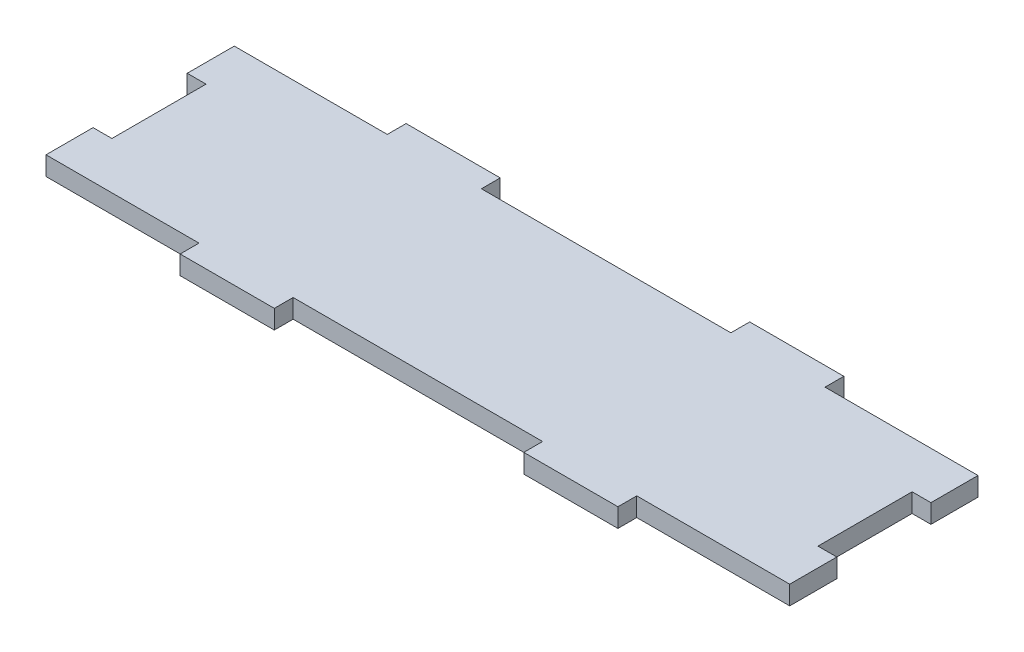
ISO-10303-21;
HEADER;
FILE_DESCRIPTION(('STEP AP214'),'2;1');
FILE_NAME('part.step','',(''),(''),'','','');
FILE_SCHEMA(('AUTOMOTIVE_DESIGN { 1 0 10303 214 1 1 1 1 }'));
ENDSEC;
DATA;
#1=APPLICATION_CONTEXT('core data for automotive mechanical design processes');
#2=APPLICATION_PROTOCOL_DEFINITION('international standard','automotive_design',2000,#1);
#3=PRODUCT_CONTEXT('',#1,'mechanical');
#4=PRODUCT('Part','Part','',(#3));
#5=PRODUCT_RELATED_PRODUCT_CATEGORY('part','',(#4));
#6=PRODUCT_DEFINITION_FORMATION('','',#4);
#7=PRODUCT_DEFINITION_CONTEXT('part definition',#1,'design');
#8=PRODUCT_DEFINITION('design','',#6,#7);
#9=PRODUCT_DEFINITION_SHAPE('','',#8);
#10=(LENGTH_UNIT() NAMED_UNIT(*) SI_UNIT(.MILLI.,.METRE.));
#11=(NAMED_UNIT(*) PLANE_ANGLE_UNIT() SI_UNIT($,.RADIAN.));
#12=(NAMED_UNIT(*) SI_UNIT($,.STERADIAN.) SOLID_ANGLE_UNIT());
#13=UNCERTAINTY_MEASURE_WITH_UNIT(LENGTH_MEASURE(1.E-05),#10,'distance_accuracy_value','');
#14=(GEOMETRIC_REPRESENTATION_CONTEXT(3) GLOBAL_UNCERTAINTY_ASSIGNED_CONTEXT((#13)) GLOBAL_UNIT_ASSIGNED_CONTEXT((#10,
#11,#12)) REPRESENTATION_CONTEXT('',''));
#15=CARTESIAN_POINT('',(0.,0.,0.));
#16=DIRECTION('',(0.,0.,1.));
#17=DIRECTION('',(1.,0.,0.));
#18=AXIS2_PLACEMENT_3D('',#15,#16,#17);
#19=CARTESIAN_POINT('',(0.,4.,0.));
#20=DIRECTION('',(0.,0.,-1.));
#21=DIRECTION('',(-1.,0.,0.));
#22=AXIS2_PLACEMENT_3D('',#19,#20,#21);
#23=PLANE('',#22);
#24=DIRECTION('',(1.,0.,0.));
#25=VECTOR('',#24,1.);
#26=CARTESIAN_POINT('',(0.,0.,0.));
#27=LINE('',#26,#25);
#28=CARTESIAN_POINT('',(-4.,0.,0.));
#29=VERTEX_POINT('',#28);
#30=CARTESIAN_POINT('',(28.5,0.,0.));
#31=VERTEX_POINT('',#30);
#32=EDGE_CURVE('E146',#29,#31,#27,.T.);
#33=ORIENTED_EDGE('',*,*,#32,.T.);
#34=DIRECTION('',(0.,-1.,0.));
#35=VECTOR('',#34,1.);
#36=CARTESIAN_POINT('',(28.5,4.,0.));
#37=LINE('',#36,#35);
#38=CARTESIAN_POINT('',(28.5,4.,0.));
#39=VERTEX_POINT('',#38);
#40=EDGE_CURVE('E11',#39,#31,#37,.T.);
#41=ORIENTED_EDGE('',*,*,#40,.F.);
#42=DIRECTION('',(1.,0.,0.));
#43=VECTOR('',#42,1.);
#44=CARTESIAN_POINT('',(0.,4.,0.));
#45=LINE('',#44,#43);
#46=CARTESIAN_POINT('',(-4.,4.,0.));
#47=VERTEX_POINT('',#46);
#48=EDGE_CURVE('E152',#47,#39,#45,.T.);
#49=ORIENTED_EDGE('',*,*,#48,.F.);
#50=DIRECTION('',(0.,-1.,0.));
#51=VECTOR('',#50,1.);
#52=CARTESIAN_POINT('',(-4.,4.,0.));
#53=LINE('',#52,#51);
#54=EDGE_CURVE('E246',#47,#29,#53,.T.);
#55=ORIENTED_EDGE('',*,*,#54,.T.);
#56=EDGE_LOOP('',(#33,#41,#49,#55));
#57=FACE_BOUND('',#56,.T.);
#58=ADVANCED_FACE('F34',(#57),#23,.F.);
#59=CARTESIAN_POINT('',(28.5,4.,0.));
#60=DIRECTION('',(1.,0.,0.));
#61=DIRECTION('',(0.,0.,-1.));
#62=AXIS2_PLACEMENT_3D('',#59,#60,#61);
#63=PLANE('',#62);
#64=DIRECTION('',(0.,0.,1.));
#65=VECTOR('',#64,1.);
#66=CARTESIAN_POINT('',(28.5,0.,0.));
#67=LINE('',#66,#65);
#68=CARTESIAN_POINT('',(28.5,0.,4.));
#69=VERTEX_POINT('',#68);
#70=EDGE_CURVE('E251',#31,#69,#67,.T.);
#71=ORIENTED_EDGE('',*,*,#70,.T.);
#72=DIRECTION('',(0.,-1.,0.));
#73=VECTOR('',#72,1.);
#74=CARTESIAN_POINT('',(28.5,4.,4.));
#75=LINE('',#74,#73);
#76=CARTESIAN_POINT('',(28.5,4.,4.));
#77=VERTEX_POINT('',#76);
#78=EDGE_CURVE('E42',#77,#69,#75,.T.);
#79=ORIENTED_EDGE('',*,*,#78,.F.);
#80=DIRECTION('',(0.,0.,1.));
#81=VECTOR('',#80,1.);
#82=CARTESIAN_POINT('',(28.5,4.,0.));
#83=LINE('',#82,#81);
#84=EDGE_CURVE('E454',#39,#77,#83,.T.);
#85=ORIENTED_EDGE('',*,*,#84,.F.);
#86=ORIENTED_EDGE('',*,*,#40,.T.);
#87=EDGE_LOOP('',(#71,#79,#85,#86));
#88=FACE_BOUND('',#87,.T.);
#89=ADVANCED_FACE('F457',(#88),#63,.F.);
#90=CARTESIAN_POINT('',(28.5,4.,4.));
#91=DIRECTION('',(0.,0.,-1.));
#92=DIRECTION('',(-1.,0.,0.));
#93=AXIS2_PLACEMENT_3D('',#90,#91,#92);
#94=PLANE('',#93);
#95=DIRECTION('',(1.,0.,0.));
#96=VECTOR('',#95,1.);
#97=CARTESIAN_POINT('',(28.5,0.,4.));
#98=LINE('',#97,#96);
#99=CARTESIAN_POINT('',(48.5,0.,4.));
#100=VERTEX_POINT('',#99);
#101=EDGE_CURVE('E253',#69,#100,#98,.T.);
#102=ORIENTED_EDGE('',*,*,#101,.T.);
#103=DIRECTION('',(0.,-1.,0.));
#104=VECTOR('',#103,1.);
#105=CARTESIAN_POINT('',(48.5,4.,4.));
#106=LINE('',#105,#104);
#107=CARTESIAN_POINT('',(48.5,4.,4.));
#108=VERTEX_POINT('',#107);
#109=EDGE_CURVE('E373',#108,#100,#106,.T.);
#110=ORIENTED_EDGE('',*,*,#109,.F.);
#111=DIRECTION('',(1.,0.,0.));
#112=VECTOR('',#111,1.);
#113=CARTESIAN_POINT('',(28.5,4.,4.));
#114=LINE('',#113,#112);
#115=EDGE_CURVE('E382',#77,#108,#114,.T.);
#116=ORIENTED_EDGE('',*,*,#115,.F.);
#117=ORIENTED_EDGE('',*,*,#78,.T.);
#118=EDGE_LOOP('',(#102,#110,#116,#117));
#119=FACE_BOUND('',#118,.T.);
#120=ADVANCED_FACE('F380',(#119),#94,.F.);
#121=CARTESIAN_POINT('',(48.5,4.,0.));
#122=DIRECTION('',(-1.,0.,0.));
#123=DIRECTION('',(0.,0.,1.));
#124=AXIS2_PLACEMENT_3D('',#121,#122,#123);
#125=PLANE('',#124);
#126=DIRECTION('',(0.,0.,-1.));
#127=VECTOR('',#126,1.);
#128=CARTESIAN_POINT('',(48.5,0.,0.));
#129=LINE('',#128,#127);
#130=CARTESIAN_POINT('',(48.5,0.,0.));
#131=VERTEX_POINT('',#130);
#132=EDGE_CURVE('E255',#100,#131,#129,.T.);
#133=ORIENTED_EDGE('',*,*,#132,.T.);
#134=DIRECTION('',(0.,-1.,0.));
#135=VECTOR('',#134,1.);
#136=CARTESIAN_POINT('',(48.5,4.,0.));
#137=LINE('',#136,#135);
#138=CARTESIAN_POINT('',(48.5,4.,0.));
#139=VERTEX_POINT('',#138);
#140=EDGE_CURVE('E370',#139,#131,#137,.T.);
#141=ORIENTED_EDGE('',*,*,#140,.F.);
#142=DIRECTION('',(0.,0.,-1.));
#143=VECTOR('',#142,1.);
#144=CARTESIAN_POINT('',(48.5,4.,0.));
#145=LINE('',#144,#143);
#146=EDGE_CURVE('E400',#108,#139,#145,.T.);
#147=ORIENTED_EDGE('',*,*,#146,.F.);
#148=ORIENTED_EDGE('',*,*,#109,.T.);
#149=EDGE_LOOP('',(#133,#141,#147,#148));
#150=FACE_BOUND('',#149,.T.);
#151=ADVANCED_FACE('F391',(#150),#125,.F.);
#152=CARTESIAN_POINT('',(48.5,4.,0.));
#153=DIRECTION('',(0.,0.,-1.));
#154=DIRECTION('',(-1.,0.,0.));
#155=AXIS2_PLACEMENT_3D('',#152,#153,#154);
#156=PLANE('',#155);
#157=DIRECTION('',(1.,0.,0.));
#158=VECTOR('',#157,1.);
#159=CARTESIAN_POINT('',(48.5,0.,0.));
#160=LINE('',#159,#158);
#161=CARTESIAN_POINT('',(101.5,0.,0.));
#162=VERTEX_POINT('',#161);
#163=EDGE_CURVE('E257',#131,#162,#160,.T.);
#164=ORIENTED_EDGE('',*,*,#163,.T.);
#165=DIRECTION('',(0.,-1.,0.));
#166=VECTOR('',#165,1.);
#167=CARTESIAN_POINT('',(101.5,4.,0.));
#168=LINE('',#167,#166);
#169=CARTESIAN_POINT('',(101.5,4.,0.));
#170=VERTEX_POINT('',#169);
#171=EDGE_CURVE('E367',#170,#162,#168,.T.);
#172=ORIENTED_EDGE('',*,*,#171,.F.);
#173=DIRECTION('',(1.,0.,0.));
#174=VECTOR('',#173,1.);
#175=CARTESIAN_POINT('',(48.5,4.,0.));
#176=LINE('',#175,#174);
#177=EDGE_CURVE('E397',#139,#170,#176,.T.);
#178=ORIENTED_EDGE('',*,*,#177,.F.);
#179=ORIENTED_EDGE('',*,*,#140,.T.);
#180=EDGE_LOOP('',(#164,#172,#178,#179));
#181=FACE_BOUND('',#180,.T.);
#182=ADVANCED_FACE('F395',(#181),#156,.F.);
#183=CARTESIAN_POINT('',(101.5,4.,0.));
#184=DIRECTION('',(1.,0.,0.));
#185=DIRECTION('',(0.,0.,-1.));
#186=AXIS2_PLACEMENT_3D('',#183,#184,#185);
#187=PLANE('',#186);
#188=DIRECTION('',(0.,0.,1.));
#189=VECTOR('',#188,1.);
#190=CARTESIAN_POINT('',(101.5,0.,0.));
#191=LINE('',#190,#189);
#192=CARTESIAN_POINT('',(101.5,0.,4.));
#193=VERTEX_POINT('',#192);
#194=EDGE_CURVE('E259',#162,#193,#191,.T.);
#195=ORIENTED_EDGE('',*,*,#194,.T.);
#196=DIRECTION('',(0.,-1.,0.));
#197=VECTOR('',#196,1.);
#198=CARTESIAN_POINT('',(101.5,4.,4.));
#199=LINE('',#198,#197);
#200=CARTESIAN_POINT('',(101.5,4.,4.));
#201=VERTEX_POINT('',#200);
#202=EDGE_CURVE('E364',#201,#193,#199,.T.);
#203=ORIENTED_EDGE('',*,*,#202,.F.);
#204=DIRECTION('',(0.,0.,1.));
#205=VECTOR('',#204,1.);
#206=CARTESIAN_POINT('',(101.5,4.,0.));
#207=LINE('',#206,#205);
#208=EDGE_CURVE('E399',#170,#201,#207,.T.);
#209=ORIENTED_EDGE('',*,*,#208,.F.);
#210=ORIENTED_EDGE('',*,*,#171,.T.);
#211=EDGE_LOOP('',(#195,#203,#209,#210));
#212=FACE_BOUND('',#211,.T.);
#213=ADVANCED_FACE('F469',(#212),#187,.F.);
#214=CARTESIAN_POINT('',(121.5,4.,4.));
#215=DIRECTION('',(0.,0.,-1.));
#216=DIRECTION('',(-1.,0.,0.));
#217=AXIS2_PLACEMENT_3D('',#214,#215,#216);
#218=PLANE('',#217);
#219=DIRECTION('',(1.,0.,0.));
#220=VECTOR('',#219,1.);
#221=CARTESIAN_POINT('',(121.5,0.,4.));
#222=LINE('',#221,#220);
#223=CARTESIAN_POINT('',(121.5,0.,4.));
#224=VERTEX_POINT('',#223);
#225=EDGE_CURVE('E261',#193,#224,#222,.T.);
#226=ORIENTED_EDGE('',*,*,#225,.T.);
#227=DIRECTION('',(0.,-1.,0.));
#228=VECTOR('',#227,1.);
#229=CARTESIAN_POINT('',(121.5,4.,4.));
#230=LINE('',#229,#228);
#231=CARTESIAN_POINT('',(121.5,4.,4.));
#232=VERTEX_POINT('',#231);
#233=EDGE_CURVE('E361',#232,#224,#230,.T.);
#234=ORIENTED_EDGE('',*,*,#233,.F.);
#235=DIRECTION('',(1.,0.,0.));
#236=VECTOR('',#235,1.);
#237=CARTESIAN_POINT('',(121.5,4.,4.));
#238=LINE('',#237,#236);
#239=EDGE_CURVE('E402',#201,#232,#238,.T.);
#240=ORIENTED_EDGE('',*,*,#239,.F.);
#241=ORIENTED_EDGE('',*,*,#202,.T.);
#242=EDGE_LOOP('',(#226,#234,#240,#241));
#243=FACE_BOUND('',#242,.T.);
#244=ADVANCED_FACE('F472',(#243),#218,.F.);
#245=CARTESIAN_POINT('',(121.5,4.,0.));
#246=DIRECTION('',(-1.,0.,0.));
#247=DIRECTION('',(0.,0.,1.));
#248=AXIS2_PLACEMENT_3D('',#245,#246,#247);
#249=PLANE('',#248);
#250=DIRECTION('',(0.,0.,-1.));
#251=VECTOR('',#250,1.);
#252=CARTESIAN_POINT('',(121.5,0.,0.));
#253=LINE('',#252,#251);
#254=CARTESIAN_POINT('',(121.5,0.,0.));
#255=VERTEX_POINT('',#254);
#256=EDGE_CURVE('E263',#224,#255,#253,.T.);
#257=ORIENTED_EDGE('',*,*,#256,.T.);
#258=DIRECTION('',(0.,-1.,0.));
#259=VECTOR('',#258,1.);
#260=CARTESIAN_POINT('',(121.5,4.,0.));
#261=LINE('',#260,#259);
#262=CARTESIAN_POINT('',(121.5,4.,0.));
#263=VERTEX_POINT('',#262);
#264=EDGE_CURVE('E358',#263,#255,#261,.T.);
#265=ORIENTED_EDGE('',*,*,#264,.F.);
#266=DIRECTION('',(0.,0.,-1.));
#267=VECTOR('',#266,1.);
#268=CARTESIAN_POINT('',(121.5,4.,0.));
#269=LINE('',#268,#267);
#270=EDGE_CURVE('E408',#232,#263,#269,.T.);
#271=ORIENTED_EDGE('',*,*,#270,.F.);
#272=ORIENTED_EDGE('',*,*,#233,.T.);
#273=EDGE_LOOP('',(#257,#265,#271,#272));
#274=FACE_BOUND('',#273,.T.);
#275=ADVANCED_FACE('F476',(#274),#249,.F.);
#276=CARTESIAN_POINT('',(150.,4.,0.));
#277=DIRECTION('',(0.,0.,-1.));
#278=DIRECTION('',(-1.,0.,0.));
#279=AXIS2_PLACEMENT_3D('',#276,#277,#278);
#280=PLANE('',#279);
#281=DIRECTION('',(1.,0.,0.));
#282=VECTOR('',#281,1.);
#283=CARTESIAN_POINT('',(150.,0.,0.));
#284=LINE('',#283,#282);
#285=CARTESIAN_POINT('',(154.,0.,0.));
#286=VERTEX_POINT('',#285);
#287=EDGE_CURVE('E266',#255,#286,#284,.T.);
#288=ORIENTED_EDGE('',*,*,#287,.T.);
#289=DIRECTION('',(0.,-1.,0.));
#290=VECTOR('',#289,1.);
#291=CARTESIAN_POINT('',(154.,4.,0.));
#292=LINE('',#291,#290);
#293=CARTESIAN_POINT('',(154.,4.,0.));
#294=VERTEX_POINT('',#293);
#295=EDGE_CURVE('E355',#294,#286,#292,.T.);
#296=ORIENTED_EDGE('',*,*,#295,.F.);
#297=DIRECTION('',(1.,0.,0.));
#298=VECTOR('',#297,1.);
#299=CARTESIAN_POINT('',(121.5,4.,0.));
#300=LINE('',#299,#298);
#301=EDGE_CURVE('E410',#263,#294,#300,.T.);
#302=ORIENTED_EDGE('',*,*,#301,.F.);
#303=ORIENTED_EDGE('',*,*,#264,.T.);
#304=EDGE_LOOP('',(#288,#296,#302,#303));
#305=FACE_BOUND('',#304,.T.);
#306=ADVANCED_FACE('F480',(#305),#280,.F.);
#307=CARTESIAN_POINT('',(154.,4.,0.));
#308=DIRECTION('',(-1.,0.,0.));
#309=DIRECTION('',(0.,0.,1.));
#310=AXIS2_PLACEMENT_3D('',#307,#308,#309);
#311=PLANE('',#310);
#312=DIRECTION('',(0.,0.,-1.));
#313=VECTOR('',#312,1.);
#314=CARTESIAN_POINT('',(154.,0.,0.));
#315=LINE('',#314,#313);
#316=CARTESIAN_POINT('',(154.,0.,-10.));
#317=VERTEX_POINT('',#316);
#318=EDGE_CURVE('E268',#286,#317,#315,.T.);
#319=ORIENTED_EDGE('',*,*,#318,.T.);
#320=DIRECTION('',(0.,-1.,0.));
#321=VECTOR('',#320,1.);
#322=CARTESIAN_POINT('',(154.,4.,-10.));
#323=LINE('',#322,#321);
#324=CARTESIAN_POINT('',(154.,4.,-10.));
#325=VERTEX_POINT('',#324);
#326=EDGE_CURVE('E352',#325,#317,#323,.T.);
#327=ORIENTED_EDGE('',*,*,#326,.F.);
#328=DIRECTION('',(0.,0.,-1.));
#329=VECTOR('',#328,1.);
#330=CARTESIAN_POINT('',(154.,4.,0.));
#331=LINE('',#330,#329);
#332=EDGE_CURVE('E412',#294,#325,#331,.T.);
#333=ORIENTED_EDGE('',*,*,#332,.F.);
#334=ORIENTED_EDGE('',*,*,#295,.T.);
#335=EDGE_LOOP('',(#319,#327,#333,#334));
#336=FACE_BOUND('',#335,.T.);
#337=ADVANCED_FACE('F484',(#336),#311,.F.);
#338=CARTESIAN_POINT('',(154.,4.,-10.));
#339=DIRECTION('',(0.,0.,1.));
#340=DIRECTION('',(1.,0.,0.));
#341=AXIS2_PLACEMENT_3D('',#338,#339,#340);
#342=PLANE('',#341);
#343=DIRECTION('',(-1.,0.,0.));
#344=VECTOR('',#343,1.);
#345=CARTESIAN_POINT('',(154.,0.,-10.));
#346=LINE('',#345,#344);
#347=CARTESIAN_POINT('',(150.,0.,-9.99999999999999));
#348=VERTEX_POINT('',#347);
#349=EDGE_CURVE('E270',#317,#348,#346,.T.);
#350=ORIENTED_EDGE('',*,*,#349,.T.);
#351=DIRECTION('',(0.,-1.,0.));
#352=VECTOR('',#351,1.);
#353=CARTESIAN_POINT('',(150.,4.,-9.99999999999999));
#354=LINE('',#353,#352);
#355=CARTESIAN_POINT('',(150.,4.,-9.99999999999999));
#356=VERTEX_POINT('',#355);
#357=EDGE_CURVE('E349',#356,#348,#354,.T.);
#358=ORIENTED_EDGE('',*,*,#357,.F.);
#359=DIRECTION('',(-1.,0.,0.));
#360=VECTOR('',#359,1.);
#361=CARTESIAN_POINT('',(154.,4.,-10.));
#362=LINE('',#361,#360);
#363=EDGE_CURVE('E414',#325,#356,#362,.T.);
#364=ORIENTED_EDGE('',*,*,#363,.F.);
#365=ORIENTED_EDGE('',*,*,#326,.T.);
#366=EDGE_LOOP('',(#350,#358,#364,#365));
#367=FACE_BOUND('',#366,.T.);
#368=ADVANCED_FACE('F488',(#367),#342,.F.);
#369=CARTESIAN_POINT('',(150.,4.,-9.99999999999999));
#370=DIRECTION('',(-1.,0.,0.));
#371=DIRECTION('',(0.,0.,1.));
#372=AXIS2_PLACEMENT_3D('',#369,#370,#371);
#373=PLANE('',#372);
#374=DIRECTION('',(0.,0.,-1.));
#375=VECTOR('',#374,1.);
#376=CARTESIAN_POINT('',(150.,0.,-9.99999999999999));
#377=LINE('',#376,#375);
#378=CARTESIAN_POINT('',(150.,0.,-30.));
#379=VERTEX_POINT('',#378);
#380=EDGE_CURVE('E272',#348,#379,#377,.T.);
#381=ORIENTED_EDGE('',*,*,#380,.T.);
#382=DIRECTION('',(0.,-1.,0.));
#383=VECTOR('',#382,1.);
#384=CARTESIAN_POINT('',(150.,4.,-30.));
#385=LINE('',#384,#383);
#386=CARTESIAN_POINT('',(150.,4.,-30.));
#387=VERTEX_POINT('',#386);
#388=EDGE_CURVE('E346',#387,#379,#385,.T.);
#389=ORIENTED_EDGE('',*,*,#388,.F.);
#390=DIRECTION('',(0.,0.,-1.));
#391=VECTOR('',#390,1.);
#392=CARTESIAN_POINT('',(150.,4.,-9.99999999999999));
#393=LINE('',#392,#391);
#394=EDGE_CURVE('E416',#356,#387,#393,.T.);
#395=ORIENTED_EDGE('',*,*,#394,.F.);
#396=ORIENTED_EDGE('',*,*,#357,.T.);
#397=EDGE_LOOP('',(#381,#389,#395,#396));
#398=FACE_BOUND('',#397,.T.);
#399=ADVANCED_FACE('F492',(#398),#373,.F.);
#400=CARTESIAN_POINT('',(150.,4.,-30.));
#401=DIRECTION('',(0.,0.,-1.));
#402=DIRECTION('',(-1.,0.,0.));
#403=AXIS2_PLACEMENT_3D('',#400,#401,#402);
#404=PLANE('',#403);
#405=DIRECTION('',(1.,0.,0.));
#406=VECTOR('',#405,1.);
#407=CARTESIAN_POINT('',(150.,0.,-30.));
#408=LINE('',#407,#406);
#409=CARTESIAN_POINT('',(154.,0.,-30.));
#410=VERTEX_POINT('',#409);
#411=EDGE_CURVE('E274',#379,#410,#408,.T.);
#412=ORIENTED_EDGE('',*,*,#411,.T.);
#413=DIRECTION('',(0.,-1.,0.));
#414=VECTOR('',#413,1.);
#415=CARTESIAN_POINT('',(154.,4.,-30.));
#416=LINE('',#415,#414);
#417=CARTESIAN_POINT('',(154.,4.,-30.));
#418=VERTEX_POINT('',#417);
#419=EDGE_CURVE('E343',#418,#410,#416,.T.);
#420=ORIENTED_EDGE('',*,*,#419,.F.);
#421=DIRECTION('',(1.,0.,0.));
#422=VECTOR('',#421,1.);
#423=CARTESIAN_POINT('',(150.,4.,-30.));
#424=LINE('',#423,#422);
#425=EDGE_CURVE('E418',#387,#418,#424,.T.);
#426=ORIENTED_EDGE('',*,*,#425,.F.);
#427=ORIENTED_EDGE('',*,*,#388,.T.);
#428=EDGE_LOOP('',(#412,#420,#426,#427));
#429=FACE_BOUND('',#428,.T.);
#430=ADVANCED_FACE('F496',(#429),#404,.F.);
#431=CARTESIAN_POINT('',(154.,4.,-30.));
#432=DIRECTION('',(-1.,0.,0.));
#433=DIRECTION('',(0.,0.,1.));
#434=AXIS2_PLACEMENT_3D('',#431,#432,#433);
#435=PLANE('',#434);
#436=DIRECTION('',(0.,0.,-1.));
#437=VECTOR('',#436,1.);
#438=CARTESIAN_POINT('',(154.,0.,-30.));
#439=LINE('',#438,#437);
#440=CARTESIAN_POINT('',(154.,0.,-40.));
#441=VERTEX_POINT('',#440);
#442=EDGE_CURVE('E276',#410,#441,#439,.T.);
#443=ORIENTED_EDGE('',*,*,#442,.T.);
#444=DIRECTION('',(0.,-1.,0.));
#445=VECTOR('',#444,1.);
#446=CARTESIAN_POINT('',(154.,4.,-40.));
#447=LINE('',#446,#445);
#448=CARTESIAN_POINT('',(154.,4.,-40.));
#449=VERTEX_POINT('',#448);
#450=EDGE_CURVE('E340',#449,#441,#447,.T.);
#451=ORIENTED_EDGE('',*,*,#450,.F.);
#452=DIRECTION('',(0.,0.,-1.));
#453=VECTOR('',#452,1.);
#454=CARTESIAN_POINT('',(154.,4.,-30.));
#455=LINE('',#454,#453);
#456=EDGE_CURVE('E420',#418,#449,#455,.T.);
#457=ORIENTED_EDGE('',*,*,#456,.F.);
#458=ORIENTED_EDGE('',*,*,#419,.T.);
#459=EDGE_LOOP('',(#443,#451,#457,#458));
#460=FACE_BOUND('',#459,.T.);
#461=ADVANCED_FACE('F500',(#460),#435,.F.);
#462=CARTESIAN_POINT('',(121.5,4.,-40.));
#463=DIRECTION('',(0.,0.,1.));
#464=DIRECTION('',(1.,0.,0.));
#465=AXIS2_PLACEMENT_3D('',#462,#463,#464);
#466=PLANE('',#465);
#467=DIRECTION('',(-1.,0.,0.));
#468=VECTOR('',#467,1.);
#469=CARTESIAN_POINT('',(121.5,0.,-40.));
#470=LINE('',#469,#468);
#471=CARTESIAN_POINT('',(121.5,0.,-40.));
#472=VERTEX_POINT('',#471);
#473=EDGE_CURVE('E279',#441,#472,#470,.T.);
#474=ORIENTED_EDGE('',*,*,#473,.T.);
#475=DIRECTION('',(0.,-1.,0.));
#476=VECTOR('',#475,1.);
#477=CARTESIAN_POINT('',(121.5,4.,-40.));
#478=LINE('',#477,#476);
#479=CARTESIAN_POINT('',(121.5,4.,-40.));
#480=VERTEX_POINT('',#479);
#481=EDGE_CURVE('E337',#480,#472,#478,.T.);
#482=ORIENTED_EDGE('',*,*,#481,.F.);
#483=DIRECTION('',(-1.,0.,0.));
#484=VECTOR('',#483,1.);
#485=CARTESIAN_POINT('',(154.,4.,-40.));
#486=LINE('',#485,#484);
#487=EDGE_CURVE('E422',#449,#480,#486,.T.);
#488=ORIENTED_EDGE('',*,*,#487,.F.);
#489=ORIENTED_EDGE('',*,*,#450,.T.);
#490=EDGE_LOOP('',(#474,#482,#488,#489));
#491=FACE_BOUND('',#490,.T.);
#492=ADVANCED_FACE('F504',(#491),#466,.F.);
#493=CARTESIAN_POINT('',(121.5,4.,-40.));
#494=DIRECTION('',(-1.,0.,0.));
#495=DIRECTION('',(0.,0.,1.));
#496=AXIS2_PLACEMENT_3D('',#493,#494,#495);
#497=PLANE('',#496);
#498=DIRECTION('',(0.,0.,-1.));
#499=VECTOR('',#498,1.);
#500=CARTESIAN_POINT('',(121.5,0.,-40.));
#501=LINE('',#500,#499);
#502=CARTESIAN_POINT('',(121.5,0.,-44.));
#503=VERTEX_POINT('',#502);
#504=EDGE_CURVE('E281',#472,#503,#501,.T.);
#505=ORIENTED_EDGE('',*,*,#504,.T.);
#506=DIRECTION('',(0.,-1.,0.));
#507=VECTOR('',#506,1.);
#508=CARTESIAN_POINT('',(121.5,4.,-44.));
#509=LINE('',#508,#507);
#510=CARTESIAN_POINT('',(121.5,4.,-44.));
#511=VERTEX_POINT('',#510);
#512=EDGE_CURVE('E334',#511,#503,#509,.T.);
#513=ORIENTED_EDGE('',*,*,#512,.F.);
#514=DIRECTION('',(0.,0.,-1.));
#515=VECTOR('',#514,1.);
#516=CARTESIAN_POINT('',(121.5,4.,-40.));
#517=LINE('',#516,#515);
#518=EDGE_CURVE('E424',#480,#511,#517,.T.);
#519=ORIENTED_EDGE('',*,*,#518,.F.);
#520=ORIENTED_EDGE('',*,*,#481,.T.);
#521=EDGE_LOOP('',(#505,#513,#519,#520));
#522=FACE_BOUND('',#521,.T.);
#523=ADVANCED_FACE('F508',(#522),#497,.F.);
#524=CARTESIAN_POINT('',(121.5,4.,-44.));
#525=DIRECTION('',(0.,0.,1.));
#526=DIRECTION('',(1.,0.,0.));
#527=AXIS2_PLACEMENT_3D('',#524,#525,#526);
#528=PLANE('',#527);
#529=DIRECTION('',(-1.,0.,0.));
#530=VECTOR('',#529,1.);
#531=CARTESIAN_POINT('',(121.5,0.,-44.));
#532=LINE('',#531,#530);
#533=CARTESIAN_POINT('',(101.5,0.,-44.));
#534=VERTEX_POINT('',#533);
#535=EDGE_CURVE('E283',#503,#534,#532,.T.);
#536=ORIENTED_EDGE('',*,*,#535,.T.);
#537=DIRECTION('',(0.,-1.,0.));
#538=VECTOR('',#537,1.);
#539=CARTESIAN_POINT('',(101.5,4.,-44.));
#540=LINE('',#539,#538);
#541=CARTESIAN_POINT('',(101.5,4.,-44.));
#542=VERTEX_POINT('',#541);
#543=EDGE_CURVE('E331',#542,#534,#540,.T.);
#544=ORIENTED_EDGE('',*,*,#543,.F.);
#545=DIRECTION('',(-1.,0.,0.));
#546=VECTOR('',#545,1.);
#547=CARTESIAN_POINT('',(121.5,4.,-44.));
#548=LINE('',#547,#546);
#549=EDGE_CURVE('E426',#511,#542,#548,.T.);
#550=ORIENTED_EDGE('',*,*,#549,.F.);
#551=ORIENTED_EDGE('',*,*,#512,.T.);
#552=EDGE_LOOP('',(#536,#544,#550,#551));
#553=FACE_BOUND('',#552,.T.);
#554=ADVANCED_FACE('F512',(#553),#528,.F.);
#555=CARTESIAN_POINT('',(101.5,4.,-40.));
#556=DIRECTION('',(1.,0.,0.));
#557=DIRECTION('',(0.,0.,-1.));
#558=AXIS2_PLACEMENT_3D('',#555,#556,#557);
#559=PLANE('',#558);
#560=DIRECTION('',(0.,0.,1.));
#561=VECTOR('',#560,1.);
#562=CARTESIAN_POINT('',(101.5,0.,-40.));
#563=LINE('',#562,#561);
#564=CARTESIAN_POINT('',(101.5,0.,-40.));
#565=VERTEX_POINT('',#564);
#566=EDGE_CURVE('E285',#534,#565,#563,.T.);
#567=ORIENTED_EDGE('',*,*,#566,.T.);
#568=DIRECTION('',(0.,-1.,0.));
#569=VECTOR('',#568,1.);
#570=CARTESIAN_POINT('',(101.5,4.,-40.));
#571=LINE('',#570,#569);
#572=CARTESIAN_POINT('',(101.5,4.,-40.));
#573=VERTEX_POINT('',#572);
#574=EDGE_CURVE('E328',#573,#565,#571,.T.);
#575=ORIENTED_EDGE('',*,*,#574,.F.);
#576=DIRECTION('',(0.,0.,1.));
#577=VECTOR('',#576,1.);
#578=CARTESIAN_POINT('',(101.5,4.,-40.));
#579=LINE('',#578,#577);
#580=EDGE_CURVE('E428',#542,#573,#579,.T.);
#581=ORIENTED_EDGE('',*,*,#580,.F.);
#582=ORIENTED_EDGE('',*,*,#543,.T.);
#583=EDGE_LOOP('',(#567,#575,#581,#582));
#584=FACE_BOUND('',#583,.T.);
#585=ADVANCED_FACE('F516',(#584),#559,.F.);
#586=CARTESIAN_POINT('',(48.5,4.,-40.));
#587=DIRECTION('',(0.,0.,1.));
#588=DIRECTION('',(1.,0.,0.));
#589=AXIS2_PLACEMENT_3D('',#586,#587,#588);
#590=PLANE('',#589);
#591=DIRECTION('',(-1.,0.,0.));
#592=VECTOR('',#591,1.);
#593=CARTESIAN_POINT('',(48.5,0.,-40.));
#594=LINE('',#593,#592);
#595=CARTESIAN_POINT('',(48.5,0.,-40.));
#596=VERTEX_POINT('',#595);
#597=EDGE_CURVE('E287',#565,#596,#594,.T.);
#598=ORIENTED_EDGE('',*,*,#597,.T.);
#599=DIRECTION('',(0.,-1.,0.));
#600=VECTOR('',#599,1.);
#601=CARTESIAN_POINT('',(48.5,4.,-40.));
#602=LINE('',#601,#600);
#603=CARTESIAN_POINT('',(48.5,4.,-40.));
#604=VERTEX_POINT('',#603);
#605=EDGE_CURVE('E325',#604,#596,#602,.T.);
#606=ORIENTED_EDGE('',*,*,#605,.F.);
#607=DIRECTION('',(-1.,0.,0.));
#608=VECTOR('',#607,1.);
#609=CARTESIAN_POINT('',(48.5,4.,-40.));
#610=LINE('',#609,#608);
#611=EDGE_CURVE('E430',#573,#604,#610,.T.);
#612=ORIENTED_EDGE('',*,*,#611,.F.);
#613=ORIENTED_EDGE('',*,*,#574,.T.);
#614=EDGE_LOOP('',(#598,#606,#612,#613));
#615=FACE_BOUND('',#614,.T.);
#616=ADVANCED_FACE('F520',(#615),#590,.F.);
#617=CARTESIAN_POINT('',(48.5,4.,-40.));
#618=DIRECTION('',(-1.,0.,0.));
#619=DIRECTION('',(0.,0.,1.));
#620=AXIS2_PLACEMENT_3D('',#617,#618,#619);
#621=PLANE('',#620);
#622=DIRECTION('',(0.,0.,-1.));
#623=VECTOR('',#622,1.);
#624=CARTESIAN_POINT('',(48.5,0.,-40.));
#625=LINE('',#624,#623);
#626=CARTESIAN_POINT('',(48.5,0.,-44.));
#627=VERTEX_POINT('',#626);
#628=EDGE_CURVE('E289',#596,#627,#625,.T.);
#629=ORIENTED_EDGE('',*,*,#628,.T.);
#630=DIRECTION('',(0.,-1.,0.));
#631=VECTOR('',#630,1.);
#632=CARTESIAN_POINT('',(48.5,4.,-44.));
#633=LINE('',#632,#631);
#634=CARTESIAN_POINT('',(48.5,4.,-44.));
#635=VERTEX_POINT('',#634);
#636=EDGE_CURVE('E322',#635,#627,#633,.T.);
#637=ORIENTED_EDGE('',*,*,#636,.F.);
#638=DIRECTION('',(0.,0.,-1.));
#639=VECTOR('',#638,1.);
#640=CARTESIAN_POINT('',(48.5,4.,-40.));
#641=LINE('',#640,#639);
#642=EDGE_CURVE('E432',#604,#635,#641,.T.);
#643=ORIENTED_EDGE('',*,*,#642,.F.);
#644=ORIENTED_EDGE('',*,*,#605,.T.);
#645=EDGE_LOOP('',(#629,#637,#643,#644));
#646=FACE_BOUND('',#645,.T.);
#647=ADVANCED_FACE('F524',(#646),#621,.F.);
#648=CARTESIAN_POINT('',(28.5,4.,-44.));
#649=DIRECTION('',(0.,0.,1.));
#650=DIRECTION('',(1.,0.,0.));
#651=AXIS2_PLACEMENT_3D('',#648,#649,#650);
#652=PLANE('',#651);
#653=DIRECTION('',(-1.,0.,0.));
#654=VECTOR('',#653,1.);
#655=CARTESIAN_POINT('',(28.5,0.,-44.));
#656=LINE('',#655,#654);
#657=CARTESIAN_POINT('',(28.5,0.,-44.));
#658=VERTEX_POINT('',#657);
#659=EDGE_CURVE('E291',#627,#658,#656,.T.);
#660=ORIENTED_EDGE('',*,*,#659,.T.);
#661=DIRECTION('',(0.,-1.,0.));
#662=VECTOR('',#661,1.);
#663=CARTESIAN_POINT('',(28.5,4.,-44.));
#664=LINE('',#663,#662);
#665=CARTESIAN_POINT('',(28.5,4.,-44.));
#666=VERTEX_POINT('',#665);
#667=EDGE_CURVE('E319',#666,#658,#664,.T.);
#668=ORIENTED_EDGE('',*,*,#667,.F.);
#669=DIRECTION('',(-1.,0.,0.));
#670=VECTOR('',#669,1.);
#671=CARTESIAN_POINT('',(28.5,4.,-44.));
#672=LINE('',#671,#670);
#673=EDGE_CURVE('E434',#635,#666,#672,.T.);
#674=ORIENTED_EDGE('',*,*,#673,.F.);
#675=ORIENTED_EDGE('',*,*,#636,.T.);
#676=EDGE_LOOP('',(#660,#668,#674,#675));
#677=FACE_BOUND('',#676,.T.);
#678=ADVANCED_FACE('F528',(#677),#652,.F.);
#679=CARTESIAN_POINT('',(28.5,4.,-40.));
#680=DIRECTION('',(1.,0.,0.));
#681=DIRECTION('',(0.,0.,-1.));
#682=AXIS2_PLACEMENT_3D('',#679,#680,#681);
#683=PLANE('',#682);
#684=DIRECTION('',(0.,0.,1.));
#685=VECTOR('',#684,1.);
#686=CARTESIAN_POINT('',(28.5,0.,-40.));
#687=LINE('',#686,#685);
#688=CARTESIAN_POINT('',(28.5,0.,-40.));
#689=VERTEX_POINT('',#688);
#690=EDGE_CURVE('E293',#658,#689,#687,.T.);
#691=ORIENTED_EDGE('',*,*,#690,.T.);
#692=DIRECTION('',(0.,-1.,0.));
#693=VECTOR('',#692,1.);
#694=CARTESIAN_POINT('',(28.5,4.,-40.));
#695=LINE('',#694,#693);
#696=CARTESIAN_POINT('',(28.5,4.,-40.));
#697=VERTEX_POINT('',#696);
#698=EDGE_CURVE('E316',#697,#689,#695,.T.);
#699=ORIENTED_EDGE('',*,*,#698,.F.);
#700=DIRECTION('',(0.,0.,1.));
#701=VECTOR('',#700,1.);
#702=CARTESIAN_POINT('',(28.5,4.,-40.));
#703=LINE('',#702,#701);
#704=EDGE_CURVE('E436',#666,#697,#703,.T.);
#705=ORIENTED_EDGE('',*,*,#704,.F.);
#706=ORIENTED_EDGE('',*,*,#667,.T.);
#707=EDGE_LOOP('',(#691,#699,#705,#706));
#708=FACE_BOUND('',#707,.T.);
#709=ADVANCED_FACE('F532',(#708),#683,.F.);
#710=CARTESIAN_POINT('',(-4.,4.,-40.));
#711=DIRECTION('',(0.,0.,1.));
#712=DIRECTION('',(1.,0.,0.));
#713=AXIS2_PLACEMENT_3D('',#710,#711,#712);
#714=PLANE('',#713);
#715=DIRECTION('',(-1.,0.,0.));
#716=VECTOR('',#715,1.);
#717=CARTESIAN_POINT('',(-4.,0.,-40.));
#718=LINE('',#717,#716);
#719=CARTESIAN_POINT('',(-4.,0.,-40.));
#720=VERTEX_POINT('',#719);
#721=EDGE_CURVE('E296',#689,#720,#718,.T.);
#722=ORIENTED_EDGE('',*,*,#721,.T.);
#723=DIRECTION('',(0.,-1.,0.));
#724=VECTOR('',#723,1.);
#725=CARTESIAN_POINT('',(-4.,4.,-40.));
#726=LINE('',#725,#724);
#727=CARTESIAN_POINT('',(-4.,4.,-40.));
#728=VERTEX_POINT('',#727);
#729=EDGE_CURVE('E313',#728,#720,#726,.T.);
#730=ORIENTED_EDGE('',*,*,#729,.F.);
#731=DIRECTION('',(-1.,0.,0.));
#732=VECTOR('',#731,1.);
#733=CARTESIAN_POINT('',(0.,4.,-40.));
#734=LINE('',#733,#732);
#735=EDGE_CURVE('E438',#697,#728,#734,.T.);
#736=ORIENTED_EDGE('',*,*,#735,.F.);
#737=ORIENTED_EDGE('',*,*,#698,.T.);
#738=EDGE_LOOP('',(#722,#730,#736,#737));
#739=FACE_BOUND('',#738,.T.);
#740=ADVANCED_FACE('F536',(#739),#714,.F.);
#741=CARTESIAN_POINT('',(-4.,4.,-30.));
#742=DIRECTION('',(1.,0.,0.));
#743=DIRECTION('',(0.,0.,-1.));
#744=AXIS2_PLACEMENT_3D('',#741,#742,#743);
#745=PLANE('',#744);
#746=DIRECTION('',(0.,0.,1.));
#747=VECTOR('',#746,1.);
#748=CARTESIAN_POINT('',(-4.,0.,-30.));
#749=LINE('',#748,#747);
#750=CARTESIAN_POINT('',(-4.,0.,-30.));
#751=VERTEX_POINT('',#750);
#752=EDGE_CURVE('E298',#720,#751,#749,.T.);
#753=ORIENTED_EDGE('',*,*,#752,.T.);
#754=DIRECTION('',(0.,-1.,0.));
#755=VECTOR('',#754,1.);
#756=CARTESIAN_POINT('',(-4.,4.,-30.));
#757=LINE('',#756,#755);
#758=CARTESIAN_POINT('',(-4.,4.,-30.));
#759=VERTEX_POINT('',#758);
#760=EDGE_CURVE('E310',#759,#751,#757,.T.);
#761=ORIENTED_EDGE('',*,*,#760,.F.);
#762=DIRECTION('',(0.,0.,1.));
#763=VECTOR('',#762,1.);
#764=CARTESIAN_POINT('',(-4.,4.,-30.));
#765=LINE('',#764,#763);
#766=EDGE_CURVE('E440',#728,#759,#765,.T.);
#767=ORIENTED_EDGE('',*,*,#766,.F.);
#768=ORIENTED_EDGE('',*,*,#729,.T.);
#769=EDGE_LOOP('',(#753,#761,#767,#768));
#770=FACE_BOUND('',#769,.T.);
#771=ADVANCED_FACE('F446',(#770),#745,.F.);
#772=CARTESIAN_POINT('',(0.,4.,-30.));
#773=DIRECTION('',(0.,0.,-1.));
#774=DIRECTION('',(-1.,0.,0.));
#775=AXIS2_PLACEMENT_3D('',#772,#773,#774);
#776=PLANE('',#775);
#777=DIRECTION('',(1.,0.,0.));
#778=VECTOR('',#777,1.);
#779=CARTESIAN_POINT('',(0.,0.,-30.));
#780=LINE('',#779,#778);
#781=CARTESIAN_POINT('',(0.,0.,-30.));
#782=VERTEX_POINT('',#781);
#783=EDGE_CURVE('E300',#751,#782,#780,.T.);
#784=ORIENTED_EDGE('',*,*,#783,.T.);
#785=DIRECTION('',(0.,-1.,0.));
#786=VECTOR('',#785,1.);
#787=CARTESIAN_POINT('',(0.,4.,-30.));
#788=LINE('',#787,#786);
#789=CARTESIAN_POINT('',(0.,4.,-30.));
#790=VERTEX_POINT('',#789);
#791=EDGE_CURVE('E241',#790,#782,#788,.T.);
#792=ORIENTED_EDGE('',*,*,#791,.F.);
#793=DIRECTION('',(1.,0.,0.));
#794=VECTOR('',#793,1.);
#795=CARTESIAN_POINT('',(0.,4.,-30.));
#796=LINE('',#795,#794);
#797=EDGE_CURVE('E232',#759,#790,#796,.T.);
#798=ORIENTED_EDGE('',*,*,#797,.F.);
#799=ORIENTED_EDGE('',*,*,#760,.T.);
#800=EDGE_LOOP('',(#784,#792,#798,#799));
#801=FACE_BOUND('',#800,.T.);
#802=ADVANCED_FACE('F450',(#801),#776,.F.);
#803=CARTESIAN_POINT('',(0.,4.,-9.99999999999999));
#804=DIRECTION('',(1.,0.,0.));
#805=DIRECTION('',(0.,0.,-1.));
#806=AXIS2_PLACEMENT_3D('',#803,#804,#805);
#807=PLANE('',#806);
#808=DIRECTION('',(0.,0.,1.));
#809=VECTOR('',#808,1.);
#810=CARTESIAN_POINT('',(0.,0.,-9.99999999999999));
#811=LINE('',#810,#809);
#812=CARTESIAN_POINT('',(0.,0.,-9.99999999999999));
#813=VERTEX_POINT('',#812);
#814=EDGE_CURVE('E240',#782,#813,#811,.T.);
#815=ORIENTED_EDGE('',*,*,#814,.T.);
#816=DIRECTION('',(0.,-1.,0.));
#817=VECTOR('',#816,1.);
#818=CARTESIAN_POINT('',(0.,4.,-9.99999999999999));
#819=LINE('',#818,#817);
#820=CARTESIAN_POINT('',(0.,4.,-9.99999999999999));
#821=VERTEX_POINT('',#820);
#822=EDGE_CURVE('E237',#821,#813,#819,.T.);
#823=ORIENTED_EDGE('',*,*,#822,.F.);
#824=DIRECTION('',(0.,0.,1.));
#825=VECTOR('',#824,1.);
#826=CARTESIAN_POINT('',(0.,4.,-9.99999999999999));
#827=LINE('',#826,#825);
#828=EDGE_CURVE('E226',#790,#821,#827,.T.);
#829=ORIENTED_EDGE('',*,*,#828,.F.);
#830=ORIENTED_EDGE('',*,*,#791,.T.);
#831=EDGE_LOOP('',(#815,#823,#829,#830));
#832=FACE_BOUND('',#831,.T.);
#833=ADVANCED_FACE('F238',(#832),#807,.F.);
#834=CARTESIAN_POINT('',(-4.,4.,-10.));
#835=DIRECTION('',(0.,0.,1.));
#836=DIRECTION('',(1.,0.,0.));
#837=AXIS2_PLACEMENT_3D('',#834,#835,#836);
#838=PLANE('',#837);
#839=DIRECTION('',(-1.,0.,0.));
#840=VECTOR('',#839,1.);
#841=CARTESIAN_POINT('',(-4.,0.,-10.));
#842=LINE('',#841,#840);
#843=CARTESIAN_POINT('',(-4.,0.,-10.));
#844=VERTEX_POINT('',#843);
#845=EDGE_CURVE('E139',#813,#844,#842,.T.);
#846=ORIENTED_EDGE('',*,*,#845,.T.);
#847=DIRECTION('',(0.,-1.,0.));
#848=VECTOR('',#847,1.);
#849=CARTESIAN_POINT('',(-4.,4.,-10.));
#850=LINE('',#849,#848);
#851=CARTESIAN_POINT('',(-4.,4.,-10.));
#852=VERTEX_POINT('',#851);
#853=EDGE_CURVE('E242',#852,#844,#850,.T.);
#854=ORIENTED_EDGE('',*,*,#853,.F.);
#855=DIRECTION('',(-1.,0.,0.));
#856=VECTOR('',#855,1.);
#857=CARTESIAN_POINT('',(-4.,4.,-10.));
#858=LINE('',#857,#856);
#859=EDGE_CURVE('E230',#821,#852,#858,.T.);
#860=ORIENTED_EDGE('',*,*,#859,.F.);
#861=ORIENTED_EDGE('',*,*,#822,.T.);
#862=EDGE_LOOP('',(#846,#854,#860,#861));
#863=FACE_BOUND('',#862,.T.);
#864=ADVANCED_FACE('F244',(#863),#838,.F.);
#865=CARTESIAN_POINT('',(-4.,4.,0.));
#866=DIRECTION('',(1.,0.,0.));
#867=DIRECTION('',(0.,0.,-1.));
#868=AXIS2_PLACEMENT_3D('',#865,#866,#867);
#869=PLANE('',#868);
#870=DIRECTION('',(0.,0.,1.));
#871=VECTOR('',#870,1.);
#872=CARTESIAN_POINT('',(-4.,0.,0.));
#873=LINE('',#872,#871);
#874=EDGE_CURVE('E304',#844,#29,#873,.T.);
#875=ORIENTED_EDGE('',*,*,#874,.T.);
#876=ORIENTED_EDGE('',*,*,#54,.F.);
#877=DIRECTION('',(0.,0.,1.));
#878=VECTOR('',#877,1.);
#879=CARTESIAN_POINT('',(-4.,4.,0.));
#880=LINE('',#879,#878);
#881=EDGE_CURVE('E50',#852,#47,#880,.T.);
#882=ORIENTED_EDGE('',*,*,#881,.F.);
#883=ORIENTED_EDGE('',*,*,#853,.T.);
#884=EDGE_LOOP('',(#875,#876,#882,#883));
#885=FACE_BOUND('',#884,.T.);
#886=ADVANCED_FACE('F452',(#885),#869,.F.);
#887=CARTESIAN_POINT('',(0.,4.,0.));
#888=DIRECTION('',(0.,-1.,0.));
#889=DIRECTION('',(0.,0.,-1.));
#890=AXIS2_PLACEMENT_3D('',#887,#888,#889);
#891=PLANE('',#890);
#892=ORIENTED_EDGE('',*,*,#48,.T.);
#893=ORIENTED_EDGE('',*,*,#84,.T.);
#894=ORIENTED_EDGE('',*,*,#115,.T.);
#895=ORIENTED_EDGE('',*,*,#146,.T.);
#896=ORIENTED_EDGE('',*,*,#177,.T.);
#897=ORIENTED_EDGE('',*,*,#208,.T.);
#898=ORIENTED_EDGE('',*,*,#239,.T.);
#899=ORIENTED_EDGE('',*,*,#270,.T.);
#900=ORIENTED_EDGE('',*,*,#301,.T.);
#901=ORIENTED_EDGE('',*,*,#332,.T.);
#902=ORIENTED_EDGE('',*,*,#363,.T.);
#903=ORIENTED_EDGE('',*,*,#394,.T.);
#904=ORIENTED_EDGE('',*,*,#425,.T.);
#905=ORIENTED_EDGE('',*,*,#456,.T.);
#906=ORIENTED_EDGE('',*,*,#487,.T.);
#907=ORIENTED_EDGE('',*,*,#518,.T.);
#908=ORIENTED_EDGE('',*,*,#549,.T.);
#909=ORIENTED_EDGE('',*,*,#580,.T.);
#910=ORIENTED_EDGE('',*,*,#611,.T.);
#911=ORIENTED_EDGE('',*,*,#642,.T.);
#912=ORIENTED_EDGE('',*,*,#673,.T.);
#913=ORIENTED_EDGE('',*,*,#704,.T.);
#914=ORIENTED_EDGE('',*,*,#735,.T.);
#915=ORIENTED_EDGE('',*,*,#766,.T.);
#916=ORIENTED_EDGE('',*,*,#797,.T.);
#917=ORIENTED_EDGE('',*,*,#828,.T.);
#918=ORIENTED_EDGE('',*,*,#859,.T.);
#919=ORIENTED_EDGE('',*,*,#881,.T.);
#920=EDGE_LOOP('',(#892,#893,#894,#895,#896,#897,#898,#899,#900,#901,#902,#903,#904,#905,#906,
#907,#908,#909,#910,#911,#912,#913,#914,#915,#916,#917,#918,#919));
#921=FACE_BOUND('',#920,.T.);
#922=ADVANCED_FACE('F228',(#921),#891,.F.);
#923=CARTESIAN_POINT('',(0.,0.,0.));
#924=DIRECTION('',(0.,-1.,0.));
#925=DIRECTION('',(0.,0.,-1.));
#926=AXIS2_PLACEMENT_3D('',#923,#924,#925);
#927=PLANE('',#926);
#928=ORIENTED_EDGE('',*,*,#32,.F.);
#929=ORIENTED_EDGE('',*,*,#874,.F.);
#930=ORIENTED_EDGE('',*,*,#845,.F.);
#931=ORIENTED_EDGE('',*,*,#814,.F.);
#932=ORIENTED_EDGE('',*,*,#783,.F.);
#933=ORIENTED_EDGE('',*,*,#752,.F.);
#934=ORIENTED_EDGE('',*,*,#721,.F.);
#935=ORIENTED_EDGE('',*,*,#690,.F.);
#936=ORIENTED_EDGE('',*,*,#659,.F.);
#937=ORIENTED_EDGE('',*,*,#628,.F.);
#938=ORIENTED_EDGE('',*,*,#597,.F.);
#939=ORIENTED_EDGE('',*,*,#566,.F.);
#940=ORIENTED_EDGE('',*,*,#535,.F.);
#941=ORIENTED_EDGE('',*,*,#504,.F.);
#942=ORIENTED_EDGE('',*,*,#473,.F.);
#943=ORIENTED_EDGE('',*,*,#442,.F.);
#944=ORIENTED_EDGE('',*,*,#411,.F.);
#945=ORIENTED_EDGE('',*,*,#380,.F.);
#946=ORIENTED_EDGE('',*,*,#349,.F.);
#947=ORIENTED_EDGE('',*,*,#318,.F.);
#948=ORIENTED_EDGE('',*,*,#287,.F.);
#949=ORIENTED_EDGE('',*,*,#256,.F.);
#950=ORIENTED_EDGE('',*,*,#225,.F.);
#951=ORIENTED_EDGE('',*,*,#194,.F.);
#952=ORIENTED_EDGE('',*,*,#163,.F.);
#953=ORIENTED_EDGE('',*,*,#132,.F.);
#954=ORIENTED_EDGE('',*,*,#101,.F.);
#955=ORIENTED_EDGE('',*,*,#70,.F.);
#956=EDGE_LOOP('',(#928,#929,#930,#931,#932,#933,#934,#935,#936,#937,#938,#939,#940,#941,#942,
#943,#944,#945,#946,#947,#948,#949,#950,#951,#952,#953,#954,#955));
#957=FACE_BOUND('',#956,.T.);
#958=ADVANCED_FACE('F386',(#957),#927,.T.);
#959=CLOSED_SHELL('',(#58,#89,#120,#151,#182,#213,#244,#275,#306,#337,#368,#399,#430,#461,#492,
#523,#554,#585,#616,#647,#678,#709,#740,#771,#802,#833,#864,#886,#922,#958));
#960=MANIFOLD_SOLID_BREP('B2',#959);
#961=ADVANCED_BREP_SHAPE_REPRESENTATION('',(#18,#960),#14);
#962=SHAPE_DEFINITION_REPRESENTATION(#9,#961);
ENDSEC;
END-ISO-10303-21;
